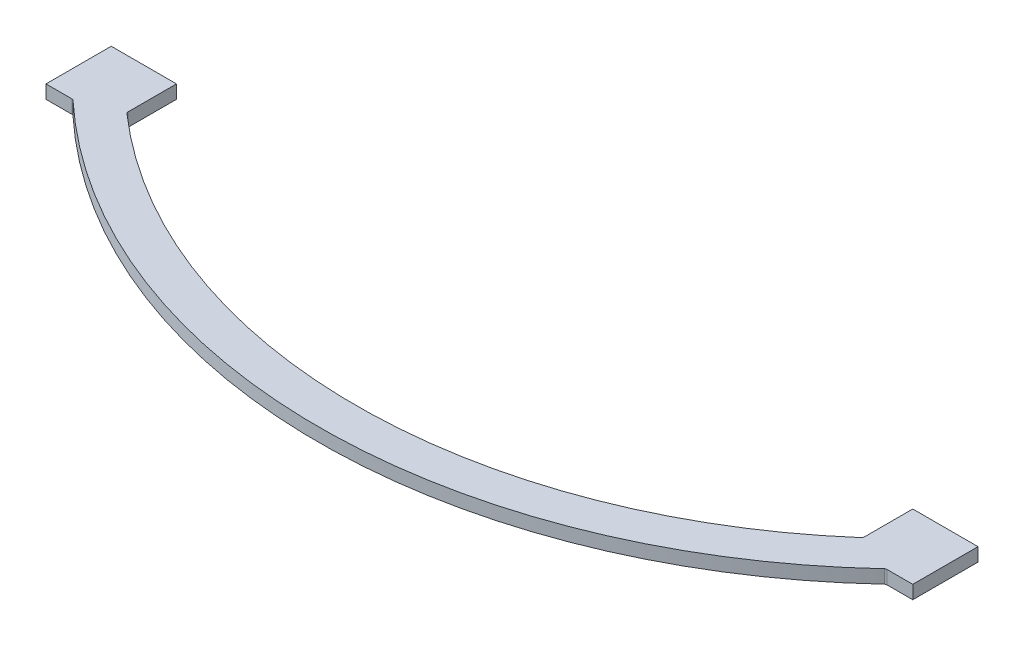
ISO-10303-21;
HEADER;
FILE_DESCRIPTION(('STEP AP214'),'2;1');
FILE_NAME('part.step','',(''),(''),'','','');
FILE_SCHEMA(('AUTOMOTIVE_DESIGN { 1 0 10303 214 1 1 1 1 }'));
ENDSEC;
DATA;
#1=APPLICATION_CONTEXT('core data for automotive mechanical design processes');
#2=APPLICATION_PROTOCOL_DEFINITION('international standard','automotive_design',2000,#1);
#3=PRODUCT_CONTEXT('',#1,'mechanical');
#4=PRODUCT('Part','Part','',(#3));
#5=PRODUCT_RELATED_PRODUCT_CATEGORY('part','',(#4));
#6=PRODUCT_DEFINITION_FORMATION('','',#4);
#7=PRODUCT_DEFINITION_CONTEXT('part definition',#1,'design');
#8=PRODUCT_DEFINITION('design','',#6,#7);
#9=PRODUCT_DEFINITION_SHAPE('','',#8);
#10=(LENGTH_UNIT() NAMED_UNIT(*) SI_UNIT(.MILLI.,.METRE.));
#11=(NAMED_UNIT(*) PLANE_ANGLE_UNIT() SI_UNIT($,.RADIAN.));
#12=(NAMED_UNIT(*) SI_UNIT($,.STERADIAN.) SOLID_ANGLE_UNIT());
#13=UNCERTAINTY_MEASURE_WITH_UNIT(LENGTH_MEASURE(1.E-05),#10,'distance_accuracy_value','');
#14=(GEOMETRIC_REPRESENTATION_CONTEXT(3) GLOBAL_UNCERTAINTY_ASSIGNED_CONTEXT((#13)) GLOBAL_UNIT_ASSIGNED_CONTEXT((#10,
#11,#12)) REPRESENTATION_CONTEXT('',''));
#15=CARTESIAN_POINT('',(0.,0.,0.));
#16=DIRECTION('',(0.,0.,1.));
#17=DIRECTION('',(1.,0.,0.));
#18=AXIS2_PLACEMENT_3D('',#15,#16,#17);
#19=CARTESIAN_POINT('',(-501.650000000002,18.25625,501.649999999998));
#20=DIRECTION('',(-1.,0.,0.));
#21=DIRECTION('',(0.,0.,1.));
#22=AXIS2_PLACEMENT_3D('',#19,#20,#21);
#23=PLANE('',#22);
#24=DIRECTION('',(0.,0.,-1.));
#25=VECTOR('',#24,1.);
#26=CARTESIAN_POINT('',(-501.650000000002,18.25625,501.649999999998));
#27=LINE('',#26,#25);
#28=CARTESIAN_POINT('',(-501.650000000002,18.25625,567.824868207617));
#29=VERTEX_POINT('',#28);
#30=CARTESIAN_POINT('',(-501.650000000002,18.25625,501.649999999998));
#31=VERTEX_POINT('',#30);
#32=EDGE_CURVE('E215',#29,#31,#27,.T.);
#33=ORIENTED_EDGE('',*,*,#32,.F.);
#34=DIRECTION('',(0.,1.,0.));
#35=VECTOR('',#34,1.);
#36=CARTESIAN_POINT('',(-501.650000000002,0.,567.824868207617));
#37=LINE('',#36,#35);
#38=CARTESIAN_POINT('',(-501.650000000002,0.,567.824868207617));
#39=VERTEX_POINT('',#38);
#40=EDGE_CURVE('E191',#29,#39,#37,.F.);
#41=ORIENTED_EDGE('',*,*,#40,.T.);
#42=DIRECTION('',(0.,0.,-1.));
#43=VECTOR('',#42,1.);
#44=CARTESIAN_POINT('',(-501.650000000002,0.,501.649999999998));
#45=LINE('',#44,#43);
#46=CARTESIAN_POINT('',(-501.650000000002,0.,501.649999999998));
#47=VERTEX_POINT('',#46);
#48=EDGE_CURVE('E210',#39,#47,#45,.T.);
#49=ORIENTED_EDGE('',*,*,#48,.T.);
#50=DIRECTION('',(0.,-1.,0.));
#51=VECTOR('',#50,1.);
#52=CARTESIAN_POINT('',(-501.650000000002,18.25625,501.649999999998));
#53=LINE('',#52,#51);
#54=EDGE_CURVE('E166',#31,#47,#53,.T.);
#55=ORIENTED_EDGE('',*,*,#54,.F.);
#56=EDGE_LOOP('',(#33,#41,#49,#55));
#57=FACE_BOUND('',#56,.T.);
#58=ADVANCED_FACE('F33',(#57),#23,.F.);
#59=CARTESIAN_POINT('',(-590.550000000002,18.25625,590.549999999998));
#60=DIRECTION('',(0.,0.,-1.));
#61=DIRECTION('',(-1.,0.,0.));
#62=AXIS2_PLACEMENT_3D('',#59,#60,#61);
#63=PLANE('',#62);
#64=DIRECTION('',(1.,0.,0.));
#65=VECTOR('',#64,1.);
#66=CARTESIAN_POINT('',(-590.550000000002,0.,590.549999999998));
#67=LINE('',#66,#65);
#68=CARTESIAN_POINT('',(-590.550000000002,0.,590.549999999998));
#69=VERTEX_POINT('',#68);
#70=CARTESIAN_POINT('',(-555.178796834857,0.,590.55));
#71=VERTEX_POINT('',#70);
#72=EDGE_CURVE('E233',#69,#71,#67,.T.);
#73=ORIENTED_EDGE('',*,*,#72,.T.);
#74=DIRECTION('',(0.,1.,0.));
#75=VECTOR('',#74,1.);
#76=CARTESIAN_POINT('',(-555.178796834857,18.25625,590.55));
#77=LINE('',#76,#75);
#78=CARTESIAN_POINT('',(-555.178796834857,18.25625,590.55));
#79=VERTEX_POINT('',#78);
#80=EDGE_CURVE('E189',#71,#79,#77,.T.);
#81=ORIENTED_EDGE('',*,*,#80,.T.);
#82=DIRECTION('',(1.,0.,0.));
#83=VECTOR('',#82,1.);
#84=CARTESIAN_POINT('',(-590.550000000002,18.25625,590.549999999998));
#85=LINE('',#84,#83);
#86=CARTESIAN_POINT('',(-590.550000000002,18.25625,590.549999999998));
#87=VERTEX_POINT('',#86);
#88=EDGE_CURVE('E221',#87,#79,#85,.T.);
#89=ORIENTED_EDGE('',*,*,#88,.F.);
#90=DIRECTION('',(0.,-1.,0.));
#91=VECTOR('',#90,1.);
#92=CARTESIAN_POINT('',(-590.550000000002,18.25625,590.549999999998));
#93=LINE('',#92,#91);
#94=EDGE_CURVE('E162',#87,#69,#93,.T.);
#95=ORIENTED_EDGE('',*,*,#94,.T.);
#96=EDGE_LOOP('',(#73,#81,#89,#95));
#97=FACE_BOUND('',#96,.T.);
#98=ADVANCED_FACE('F274',(#97),#63,.F.);
#99=CARTESIAN_POINT('',(0.,18.25625,0.));
#100=DIRECTION('',(0.,-1.,0.));
#101=DIRECTION('',(0.,0.,-1.));
#102=AXIS2_PLACEMENT_3D('',#99,#100,#101);
#103=CYLINDRICAL_SURFACE('',#102,809.625);
#104=CARTESIAN_POINT('',(0.,0.,0.));
#105=DIRECTION('',(0.,1.,0.));
#106=DIRECTION('',(0.,0.,1.));
#107=AXIS2_PLACEMENT_3D('',#104,#105,#106);
#108=CIRCLE('',#107,809.625);
#109=CARTESIAN_POINT('',(-552.871911681801,0.,591.460302893027));
#110=VERTEX_POINT('',#109);
#111=CARTESIAN_POINT('',(552.871911681801,0.,591.460302893027));
#112=VERTEX_POINT('',#111);
#113=EDGE_CURVE('E237',#110,#112,#108,.T.);
#114=ORIENTED_EDGE('',*,*,#113,.T.);
#115=DIRECTION('',(0.,-1.,0.));
#116=VECTOR('',#115,1.);
#117=CARTESIAN_POINT('',(552.871911681801,18.25625,591.460302893027));
#118=LINE('',#117,#116);
#119=CARTESIAN_POINT('',(552.871911681801,18.25625,591.460302893027));
#120=VERTEX_POINT('',#119);
#121=EDGE_CURVE('E187',#112,#120,#118,.F.);
#122=ORIENTED_EDGE('',*,*,#121,.T.);
#123=CARTESIAN_POINT('',(0.,18.25625,0.));
#124=DIRECTION('',(0.,1.,0.));
#125=DIRECTION('',(0.,0.,1.));
#126=AXIS2_PLACEMENT_3D('',#123,#124,#125);
#127=CIRCLE('',#126,809.625);
#128=CARTESIAN_POINT('',(-552.871911681801,18.25625,591.460302893027));
#129=VERTEX_POINT('',#128);
#130=EDGE_CURVE('E146',#129,#120,#127,.T.);
#131=ORIENTED_EDGE('',*,*,#130,.F.);
#132=DIRECTION('',(0.,-1.,0.));
#133=VECTOR('',#132,1.);
#134=CARTESIAN_POINT('',(-552.871911681801,18.25625,591.460302893027));
#135=LINE('',#134,#133);
#136=EDGE_CURVE('E184',#129,#110,#135,.T.);
#137=ORIENTED_EDGE('',*,*,#136,.T.);
#138=EDGE_LOOP('',(#114,#122,#131,#137));
#139=FACE_BOUND('',#138,.T.);
#140=ADVANCED_FACE('F283',(#139),#103,.T.);
#141=CARTESIAN_POINT('',(590.55,18.25625,590.55));
#142=DIRECTION('',(0.,0.,-1.));
#143=DIRECTION('',(-1.,0.,0.));
#144=AXIS2_PLACEMENT_3D('',#141,#142,#143);
#145=PLANE('',#144);
#146=DIRECTION('',(1.,0.,0.));
#147=VECTOR('',#146,1.);
#148=CARTESIAN_POINT('',(590.55,18.25625,590.55));
#149=LINE('',#148,#147);
#150=CARTESIAN_POINT('',(555.178796834858,18.25625,590.55));
#151=VERTEX_POINT('',#150);
#152=CARTESIAN_POINT('',(590.55,18.25625,590.55));
#153=VERTEX_POINT('',#152);
#154=EDGE_CURVE('E132',#151,#153,#149,.T.);
#155=ORIENTED_EDGE('',*,*,#154,.F.);
#156=DIRECTION('',(0.,1.,0.));
#157=VECTOR('',#156,1.);
#158=CARTESIAN_POINT('',(555.178796834858,0.,590.55));
#159=LINE('',#158,#157);
#160=CARTESIAN_POINT('',(555.178796834858,0.,590.55));
#161=VERTEX_POINT('',#160);
#162=EDGE_CURVE('E182',#151,#161,#159,.F.);
#163=ORIENTED_EDGE('',*,*,#162,.T.);
#164=DIRECTION('',(1.,0.,0.));
#165=VECTOR('',#164,1.);
#166=CARTESIAN_POINT('',(590.55,0.,590.55));
#167=LINE('',#166,#165);
#168=CARTESIAN_POINT('',(590.55,0.,590.55));
#169=VERTEX_POINT('',#168);
#170=EDGE_CURVE('E160',#161,#169,#167,.T.);
#171=ORIENTED_EDGE('',*,*,#170,.T.);
#172=DIRECTION('',(0.,-1.,0.));
#173=VECTOR('',#172,1.);
#174=CARTESIAN_POINT('',(590.55,18.25625,590.55));
#175=LINE('',#174,#173);
#176=EDGE_CURVE('E152',#153,#169,#175,.T.);
#177=ORIENTED_EDGE('',*,*,#176,.F.);
#178=EDGE_LOOP('',(#155,#163,#171,#177));
#179=FACE_BOUND('',#178,.T.);
#180=ADVANCED_FACE('F158',(#179),#145,.F.);
#181=CARTESIAN_POINT('',(501.65,18.25625,501.65));
#182=DIRECTION('',(1.,0.,0.));
#183=DIRECTION('',(0.,0.,-1.));
#184=AXIS2_PLACEMENT_3D('',#181,#182,#183);
#185=PLANE('',#184);
#186=DIRECTION('',(0.,0.,1.));
#187=VECTOR('',#186,1.);
#188=CARTESIAN_POINT('',(501.65,0.,501.65));
#189=LINE('',#188,#187);
#190=CARTESIAN_POINT('',(501.65,0.,501.65));
#191=VERTEX_POINT('',#190);
#192=CARTESIAN_POINT('',(501.65,0.,567.824868207619));
#193=VERTEX_POINT('',#192);
#194=EDGE_CURVE('E216',#191,#193,#189,.T.);
#195=ORIENTED_EDGE('',*,*,#194,.T.);
#196=DIRECTION('',(0.,1.,0.));
#197=VECTOR('',#196,1.);
#198=CARTESIAN_POINT('',(501.65,18.25625,567.824868207619));
#199=LINE('',#198,#197);
#200=CARTESIAN_POINT('',(501.65,18.25625,567.824868207619));
#201=VERTEX_POINT('',#200);
#202=EDGE_CURVE('E180',#193,#201,#199,.T.);
#203=ORIENTED_EDGE('',*,*,#202,.T.);
#204=DIRECTION('',(0.,0.,1.));
#205=VECTOR('',#204,1.);
#206=CARTESIAN_POINT('',(501.65,18.25625,501.65));
#207=LINE('',#206,#205);
#208=CARTESIAN_POINT('',(501.65,18.25625,501.65));
#209=VERTEX_POINT('',#208);
#210=EDGE_CURVE('E145',#209,#201,#207,.T.);
#211=ORIENTED_EDGE('',*,*,#210,.F.);
#212=DIRECTION('',(0.,-1.,0.));
#213=VECTOR('',#212,1.);
#214=CARTESIAN_POINT('',(501.65,18.25625,501.65));
#215=LINE('',#214,#213);
#216=EDGE_CURVE('E163',#209,#191,#215,.T.);
#217=ORIENTED_EDGE('',*,*,#216,.T.);
#218=EDGE_LOOP('',(#195,#203,#211,#217));
#219=FACE_BOUND('',#218,.T.);
#220=ADVANCED_FACE('F245',(#219),#185,.F.);
#221=CARTESIAN_POINT('',(0.,18.25625,0.));
#222=DIRECTION('',(0.,-1.,0.));
#223=DIRECTION('',(0.,0.,-1.));
#224=AXIS2_PLACEMENT_3D('',#221,#222,#223);
#225=CYLINDRICAL_SURFACE('',#224,758.825);
#226=CARTESIAN_POINT('',(0.,18.25625,0.));
#227=DIRECTION('',(0.,-1.,0.));
#228=DIRECTION('',(0.,0.,1.));
#229=AXIS2_PLACEMENT_3D('',#226,#227,#228);
#230=CIRCLE('',#229,758.825);
#231=CARTESIAN_POINT('',(500.499967218075,18.25625,570.364062191602));
#232=VERTEX_POINT('',#231);
#233=CARTESIAN_POINT('',(-500.499967218077,18.25625,570.3640621916));
#234=VERTEX_POINT('',#233);
#235=EDGE_CURVE('E169',#232,#234,#230,.T.);
#236=ORIENTED_EDGE('',*,*,#235,.F.);
#237=DIRECTION('',(0.,-1.,0.));
#238=VECTOR('',#237,1.);
#239=CARTESIAN_POINT('',(500.499967218075,18.25625,570.364062191602));
#240=LINE('',#239,#238);
#241=CARTESIAN_POINT('',(500.499967218075,0.,570.364062191602));
#242=VERTEX_POINT('',#241);
#243=EDGE_CURVE('E177',#232,#242,#240,.T.);
#244=ORIENTED_EDGE('',*,*,#243,.T.);
#245=CARTESIAN_POINT('',(0.,0.,0.));
#246=DIRECTION('',(0.,-1.,0.));
#247=DIRECTION('',(0.,0.,1.));
#248=AXIS2_PLACEMENT_3D('',#245,#246,#247);
#249=CIRCLE('',#248,758.825);
#250=CARTESIAN_POINT('',(-500.499967218077,0.,570.3640621916));
#251=VERTEX_POINT('',#250);
#252=EDGE_CURVE('E208',#242,#251,#249,.T.);
#253=ORIENTED_EDGE('',*,*,#252,.T.);
#254=DIRECTION('',(0.,-1.,0.));
#255=VECTOR('',#254,1.);
#256=CARTESIAN_POINT('',(-500.499967218077,18.25625,570.3640621916));
#257=LINE('',#256,#255);
#258=EDGE_CURVE('E175',#251,#234,#257,.F.);
#259=ORIENTED_EDGE('',*,*,#258,.T.);
#260=EDGE_LOOP('',(#236,#244,#253,#259));
#261=FACE_BOUND('',#260,.T.);
#262=ADVANCED_FACE('F213',(#261),#225,.F.);
#263=CARTESIAN_POINT('',(0.,18.25625,0.));
#264=DIRECTION('',(0.,1.,0.));
#265=DIRECTION('',(0.,0.,1.));
#266=AXIS2_PLACEMENT_3D('',#263,#264,#265);
#267=PLANE('',#266);
#268=ORIENTED_EDGE('',*,*,#88,.T.);
#269=CARTESIAN_POINT('',(-555.178796834858,18.25625,593.9282));
#270=DIRECTION('',(0.,1.,0.));
#271=DIRECTION('',(0.,0.,1.));
#272=AXIS2_PLACEMENT_3D('',#269,#270,#271);
#273=CIRCLE('',#272,3.3782);
#274=EDGE_CURVE('E202',#79,#129,#273,.F.);
#275=ORIENTED_EDGE('',*,*,#274,.T.);
#276=ORIENTED_EDGE('',*,*,#130,.T.);
#277=CARTESIAN_POINT('',(555.178796834858,18.25625,593.9282));
#278=DIRECTION('',(0.,1.,0.));
#279=DIRECTION('',(0.,0.,1.));
#280=AXIS2_PLACEMENT_3D('',#277,#278,#279);
#281=CIRCLE('',#280,3.3782);
#282=EDGE_CURVE('E140',#120,#151,#281,.F.);
#283=ORIENTED_EDGE('',*,*,#282,.T.);
#284=ORIENTED_EDGE('',*,*,#154,.T.);
#285=DIRECTION('',(0.,0.,-1.));
#286=VECTOR('',#285,1.);
#287=CARTESIAN_POINT('',(590.55,18.25625,501.65));
#288=LINE('',#287,#286);
#289=CARTESIAN_POINT('',(590.55,18.25625,501.65));
#290=VERTEX_POINT('',#289);
#291=EDGE_CURVE('E137',#153,#290,#288,.T.);
#292=ORIENTED_EDGE('',*,*,#291,.T.);
#293=DIRECTION('',(-1.,0.,0.));
#294=VECTOR('',#293,1.);
#295=CARTESIAN_POINT('',(501.65,18.25625,501.65));
#296=LINE('',#295,#294);
#297=EDGE_CURVE('E156',#290,#209,#296,.T.);
#298=ORIENTED_EDGE('',*,*,#297,.T.);
#299=ORIENTED_EDGE('',*,*,#210,.T.);
#300=CARTESIAN_POINT('',(498.2718,18.25625,567.824868207619));
#301=DIRECTION('',(0.,1.,0.));
#302=DIRECTION('',(0.,0.,1.));
#303=AXIS2_PLACEMENT_3D('',#300,#301,#302);
#304=CIRCLE('',#303,3.3782);
#305=EDGE_CURVE('E195',#201,#232,#304,.F.);
#306=ORIENTED_EDGE('',*,*,#305,.T.);
#307=ORIENTED_EDGE('',*,*,#235,.T.);
#308=CARTESIAN_POINT('',(-498.271800000002,18.25625,567.824868207617));
#309=DIRECTION('',(0.,1.,0.));
#310=DIRECTION('',(0.,0.,1.));
#311=AXIS2_PLACEMENT_3D('',#308,#309,#310);
#312=CIRCLE('',#311,3.3782);
#313=EDGE_CURVE('E11',#234,#29,#312,.F.);
#314=ORIENTED_EDGE('',*,*,#313,.T.);
#315=ORIENTED_EDGE('',*,*,#32,.T.);
#316=DIRECTION('',(-1.,0.,0.));
#317=VECTOR('',#316,1.);
#318=CARTESIAN_POINT('',(-590.550000000002,18.25625,501.649999999998));
#319=LINE('',#318,#317);
#320=CARTESIAN_POINT('',(-590.550000000002,18.25625,501.649999999998));
#321=VERTEX_POINT('',#320);
#322=EDGE_CURVE('E258',#31,#321,#319,.T.);
#323=ORIENTED_EDGE('',*,*,#322,.T.);
#324=DIRECTION('',(0.,0.,1.));
#325=VECTOR('',#324,1.);
#326=CARTESIAN_POINT('',(-590.550000000002,18.25625,590.549999999998));
#327=LINE('',#326,#325);
#328=EDGE_CURVE('E262',#321,#87,#327,.T.);
#329=ORIENTED_EDGE('',*,*,#328,.T.);
#330=EDGE_LOOP('',(#268,#275,#276,#283,#284,#292,#298,#299,#306,#307,#314,#315,#323,#329));
#331=FACE_BOUND('',#330,.T.);
#332=ADVANCED_FACE('F135',(#331),#267,.T.);
#333=CARTESIAN_POINT('',(0.,0.,0.));
#334=DIRECTION('',(0.,1.,0.));
#335=DIRECTION('',(0.,0.,1.));
#336=AXIS2_PLACEMENT_3D('',#333,#334,#335);
#337=PLANE('',#336);
#338=ORIENTED_EDGE('',*,*,#170,.F.);
#339=CARTESIAN_POINT('',(555.178796834858,0.,593.9282));
#340=DIRECTION('',(0.,1.,0.));
#341=DIRECTION('',(0.,0.,1.));
#342=AXIS2_PLACEMENT_3D('',#339,#340,#341);
#343=CIRCLE('',#342,3.3782);
#344=EDGE_CURVE('E197',#161,#112,#343,.T.);
#345=ORIENTED_EDGE('',*,*,#344,.T.);
#346=ORIENTED_EDGE('',*,*,#113,.F.);
#347=CARTESIAN_POINT('',(-555.178796834858,0.,593.9282));
#348=DIRECTION('',(0.,1.,0.));
#349=DIRECTION('',(0.,0.,1.));
#350=AXIS2_PLACEMENT_3D('',#347,#348,#349);
#351=CIRCLE('',#350,3.3782);
#352=EDGE_CURVE('E200',#110,#71,#351,.T.);
#353=ORIENTED_EDGE('',*,*,#352,.T.);
#354=ORIENTED_EDGE('',*,*,#72,.F.);
#355=DIRECTION('',(0.,0.,-1.));
#356=VECTOR('',#355,1.);
#357=CARTESIAN_POINT('',(-590.550000000002,0.,590.549999999998));
#358=LINE('',#357,#356);
#359=CARTESIAN_POINT('',(-590.550000000002,0.,501.649999999998));
#360=VERTEX_POINT('',#359);
#361=EDGE_CURVE('E234',#69,#360,#358,.T.);
#362=ORIENTED_EDGE('',*,*,#361,.T.);
#363=DIRECTION('',(1.,0.,0.));
#364=VECTOR('',#363,1.);
#365=CARTESIAN_POINT('',(-590.550000000002,0.,501.649999999998));
#366=LINE('',#365,#364);
#367=EDGE_CURVE('E259',#360,#47,#366,.T.);
#368=ORIENTED_EDGE('',*,*,#367,.T.);
#369=ORIENTED_EDGE('',*,*,#48,.F.);
#370=CARTESIAN_POINT('',(-498.271800000002,0.,567.824868207617));
#371=DIRECTION('',(0.,1.,0.));
#372=DIRECTION('',(0.,0.,1.));
#373=AXIS2_PLACEMENT_3D('',#370,#371,#372);
#374=CIRCLE('',#373,3.3782);
#375=EDGE_CURVE('E41',#39,#251,#374,.T.);
#376=ORIENTED_EDGE('',*,*,#375,.T.);
#377=ORIENTED_EDGE('',*,*,#252,.F.);
#378=CARTESIAN_POINT('',(498.2718,0.,567.824868207619));
#379=DIRECTION('',(0.,1.,0.));
#380=DIRECTION('',(0.,0.,1.));
#381=AXIS2_PLACEMENT_3D('',#378,#379,#380);
#382=CIRCLE('',#381,3.3782);
#383=EDGE_CURVE('E193',#242,#193,#382,.T.);
#384=ORIENTED_EDGE('',*,*,#383,.T.);
#385=ORIENTED_EDGE('',*,*,#194,.F.);
#386=DIRECTION('',(1.,0.,0.));
#387=VECTOR('',#386,1.);
#388=CARTESIAN_POINT('',(501.65,0.,501.65));
#389=LINE('',#388,#387);
#390=CARTESIAN_POINT('',(590.55,0.,501.65));
#391=VERTEX_POINT('',#390);
#392=EDGE_CURVE('E252',#191,#391,#389,.T.);
#393=ORIENTED_EDGE('',*,*,#392,.T.);
#394=DIRECTION('',(0.,0.,1.));
#395=VECTOR('',#394,1.);
#396=CARTESIAN_POINT('',(590.55,0.,501.65));
#397=LINE('',#396,#395);
#398=EDGE_CURVE('E256',#391,#169,#397,.T.);
#399=ORIENTED_EDGE('',*,*,#398,.T.);
#400=EDGE_LOOP('',(#338,#345,#346,#353,#354,#362,#368,#369,#376,#377,#384,#385,#393,#399));
#401=FACE_BOUND('',#400,.T.);
#402=ADVANCED_FACE('F207',(#401),#337,.F.);
#403=CARTESIAN_POINT('',(-590.550000000002,-125.723585694969,590.549999999998));
#404=DIRECTION('',(-1.,0.,0.));
#405=DIRECTION('',(0.,0.,1.));
#406=AXIS2_PLACEMENT_3D('',#403,#404,#405);
#407=PLANE('',#406);
#408=ORIENTED_EDGE('',*,*,#361,.F.);
#409=ORIENTED_EDGE('',*,*,#94,.F.);
#410=ORIENTED_EDGE('',*,*,#328,.F.);
#411=DIRECTION('',(0.,1.,0.));
#412=VECTOR('',#411,1.);
#413=CARTESIAN_POINT('',(-590.550000000002,-125.723585694969,501.649999999998));
#414=LINE('',#413,#412);
#415=EDGE_CURVE('E225',#360,#321,#414,.T.);
#416=ORIENTED_EDGE('',*,*,#415,.F.);
#417=EDGE_LOOP('',(#408,#409,#410,#416));
#418=FACE_BOUND('',#417,.T.);
#419=ADVANCED_FACE('F271',(#418),#407,.T.);
#420=CARTESIAN_POINT('',(-590.550000000002,-125.723585694969,501.649999999998));
#421=DIRECTION('',(0.,0.,-1.));
#422=DIRECTION('',(-1.,0.,0.));
#423=AXIS2_PLACEMENT_3D('',#420,#421,#422);
#424=PLANE('',#423);
#425=ORIENTED_EDGE('',*,*,#367,.F.);
#426=ORIENTED_EDGE('',*,*,#415,.T.);
#427=ORIENTED_EDGE('',*,*,#322,.F.);
#428=ORIENTED_EDGE('',*,*,#54,.T.);
#429=EDGE_LOOP('',(#425,#426,#427,#428));
#430=FACE_BOUND('',#429,.T.);
#431=ADVANCED_FACE('F269',(#430),#424,.T.);
#432=CARTESIAN_POINT('',(501.65,-125.723585694969,501.65));
#433=DIRECTION('',(0.,0.,-1.));
#434=DIRECTION('',(-1.,0.,0.));
#435=AXIS2_PLACEMENT_3D('',#432,#433,#434);
#436=PLANE('',#435);
#437=ORIENTED_EDGE('',*,*,#392,.F.);
#438=ORIENTED_EDGE('',*,*,#216,.F.);
#439=ORIENTED_EDGE('',*,*,#297,.F.);
#440=DIRECTION('',(0.,1.,0.));
#441=VECTOR('',#440,1.);
#442=CARTESIAN_POINT('',(590.55,-125.723585694969,501.65));
#443=LINE('',#442,#441);
#444=EDGE_CURVE('E154',#391,#290,#443,.T.);
#445=ORIENTED_EDGE('',*,*,#444,.F.);
#446=EDGE_LOOP('',(#437,#438,#439,#445));
#447=FACE_BOUND('',#446,.T.);
#448=ADVANCED_FACE('F287',(#447),#436,.T.);
#449=CARTESIAN_POINT('',(590.55,-125.723585694969,501.65));
#450=DIRECTION('',(1.,0.,0.));
#451=DIRECTION('',(0.,0.,-1.));
#452=AXIS2_PLACEMENT_3D('',#449,#450,#451);
#453=PLANE('',#452);
#454=ORIENTED_EDGE('',*,*,#398,.F.);
#455=ORIENTED_EDGE('',*,*,#444,.T.);
#456=ORIENTED_EDGE('',*,*,#291,.F.);
#457=ORIENTED_EDGE('',*,*,#176,.T.);
#458=EDGE_LOOP('',(#454,#455,#456,#457));
#459=FACE_BOUND('',#458,.T.);
#460=ADVANCED_FACE('F151',(#459),#453,.T.);
#461=CARTESIAN_POINT('',(498.2718,18.25625,567.824868207619));
#462=DIRECTION('',(0.,-1.,0.));
#463=DIRECTION('',(0.,0.,-1.));
#464=AXIS2_PLACEMENT_3D('',#461,#462,#463);
#465=CYLINDRICAL_SURFACE('',#464,3.3782);
#466=ORIENTED_EDGE('',*,*,#305,.F.);
#467=ORIENTED_EDGE('',*,*,#202,.F.);
#468=ORIENTED_EDGE('',*,*,#383,.F.);
#469=ORIENTED_EDGE('',*,*,#243,.F.);
#470=EDGE_LOOP('',(#466,#467,#468,#469));
#471=FACE_BOUND('',#470,.T.);
#472=ADVANCED_FACE('F249',(#471),#465,.F.);
#473=CARTESIAN_POINT('',(555.178796834858,18.25625,593.9282));
#474=DIRECTION('',(0.,-1.,0.));
#475=DIRECTION('',(0.,0.,-1.));
#476=AXIS2_PLACEMENT_3D('',#473,#474,#475);
#477=CYLINDRICAL_SURFACE('',#476,3.3782);
#478=ORIENTED_EDGE('',*,*,#282,.F.);
#479=ORIENTED_EDGE('',*,*,#121,.F.);
#480=ORIENTED_EDGE('',*,*,#344,.F.);
#481=ORIENTED_EDGE('',*,*,#162,.F.);
#482=EDGE_LOOP('',(#478,#479,#480,#481));
#483=FACE_BOUND('',#482,.T.);
#484=ADVANCED_FACE('F286',(#483),#477,.F.);
#485=CARTESIAN_POINT('',(-555.178796834858,18.25625,593.9282));
#486=DIRECTION('',(0.,-1.,0.));
#487=DIRECTION('',(0.,0.,-1.));
#488=AXIS2_PLACEMENT_3D('',#485,#486,#487);
#489=CYLINDRICAL_SURFACE('',#488,3.3782);
#490=ORIENTED_EDGE('',*,*,#274,.F.);
#491=ORIENTED_EDGE('',*,*,#80,.F.);
#492=ORIENTED_EDGE('',*,*,#352,.F.);
#493=ORIENTED_EDGE('',*,*,#136,.F.);
#494=EDGE_LOOP('',(#490,#491,#492,#493));
#495=FACE_BOUND('',#494,.T.);
#496=ADVANCED_FACE('F280',(#495),#489,.F.);
#497=CARTESIAN_POINT('',(-498.271800000002,18.25625,567.824868207617));
#498=DIRECTION('',(0.,-1.,0.));
#499=DIRECTION('',(0.,0.,-1.));
#500=AXIS2_PLACEMENT_3D('',#497,#498,#499);
#501=CYLINDRICAL_SURFACE('',#500,3.3782);
#502=ORIENTED_EDGE('',*,*,#313,.F.);
#503=ORIENTED_EDGE('',*,*,#258,.F.);
#504=ORIENTED_EDGE('',*,*,#375,.F.);
#505=ORIENTED_EDGE('',*,*,#40,.F.);
#506=EDGE_LOOP('',(#502,#503,#504,#505));
#507=FACE_BOUND('',#506,.T.);
#508=ADVANCED_FACE('F35',(#507),#501,.F.);
#509=CLOSED_SHELL('',(#58,#98,#140,#180,#220,#262,#332,#402,#419,#431,#448,#460,#472,#484,#496,#508));
#510=MANIFOLD_SOLID_BREP('B2',#509);
#511=ADVANCED_BREP_SHAPE_REPRESENTATION('',(#18,#510),#14);
#512=SHAPE_DEFINITION_REPRESENTATION(#9,#511);
ENDSEC;
END-ISO-10303-21;
